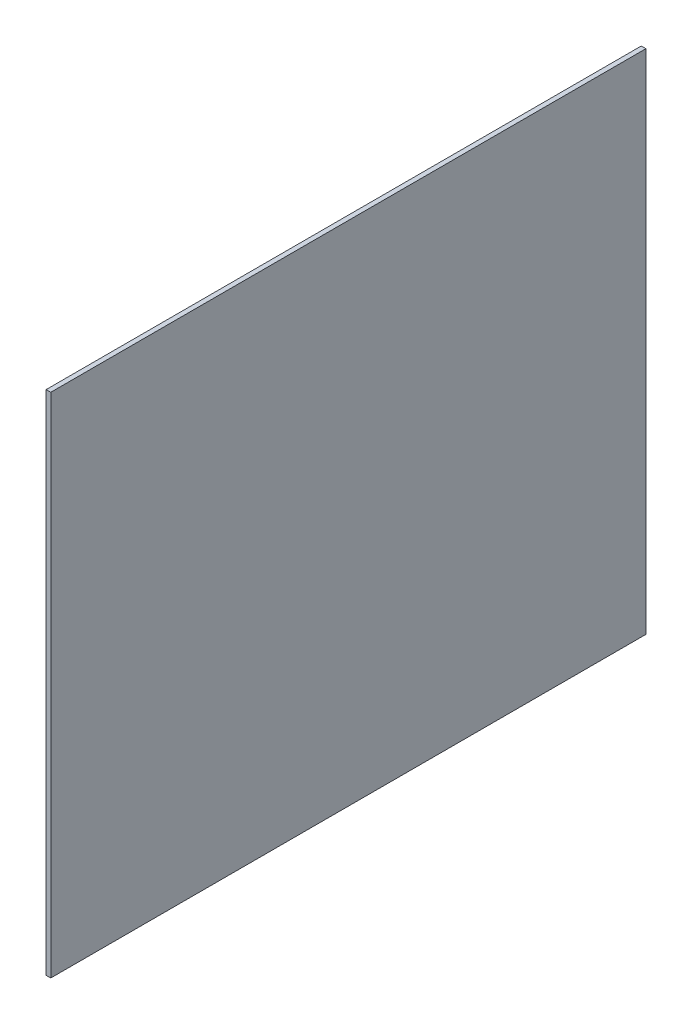
ISO-10303-21;
HEADER;
FILE_DESCRIPTION(('STEP AP214'),'2;1');
FILE_NAME('part.step','',(''),(''),'','','');
FILE_SCHEMA(('AUTOMOTIVE_DESIGN { 1 0 10303 214 1 1 1 1 }'));
ENDSEC;
DATA;
#1=APPLICATION_CONTEXT('core data for automotive mechanical design processes');
#2=APPLICATION_PROTOCOL_DEFINITION('international standard','automotive_design',2000,#1);
#3=PRODUCT_CONTEXT('',#1,'mechanical');
#4=PRODUCT('Part','Part','',(#3));
#5=PRODUCT_RELATED_PRODUCT_CATEGORY('part','',(#4));
#6=PRODUCT_DEFINITION_FORMATION('','',#4);
#7=PRODUCT_DEFINITION_CONTEXT('part definition',#1,'design');
#8=PRODUCT_DEFINITION('design','',#6,#7);
#9=PRODUCT_DEFINITION_SHAPE('','',#8);
#10=(LENGTH_UNIT() NAMED_UNIT(*) SI_UNIT(.MILLI.,.METRE.));
#11=(NAMED_UNIT(*) PLANE_ANGLE_UNIT() SI_UNIT($,.RADIAN.));
#12=(NAMED_UNIT(*) SI_UNIT($,.STERADIAN.) SOLID_ANGLE_UNIT());
#13=UNCERTAINTY_MEASURE_WITH_UNIT(LENGTH_MEASURE(1.E-05),#10,'distance_accuracy_value','');
#14=(GEOMETRIC_REPRESENTATION_CONTEXT(3) GLOBAL_UNCERTAINTY_ASSIGNED_CONTEXT((#13)) GLOBAL_UNIT_ASSIGNED_CONTEXT((#10,
#11,#12)) REPRESENTATION_CONTEXT('',''));
#15=CARTESIAN_POINT('',(0.,0.,0.));
#16=DIRECTION('',(0.,0.,1.));
#17=DIRECTION('',(1.,0.,0.));
#18=AXIS2_PLACEMENT_3D('',#15,#16,#17);
#19=CARTESIAN_POINT('',(-41.8021501378691,637.630930693683,812.00752));
#20=DIRECTION('',(1.,0.,0.));
#21=DIRECTION('',(0.,1.,0.));
#22=AXIS2_PLACEMENT_3D('',#19,#20,#21);
#23=PLANE('',#22);
#24=DIRECTION('',(0.,-1.,0.));
#25=VECTOR('',#24,1.);
#26=CARTESIAN_POINT('',(-41.8021501378691,637.630930693683,0.));
#27=LINE('',#26,#25);
#28=CARTESIAN_POINT('',(-41.8021501378691,637.630930693683,0.));
#29=VERTEX_POINT('',#28);
#30=CARTESIAN_POINT('',(-41.8021501378691,-54.5190693063172,0.));
#31=VERTEX_POINT('',#30);
#32=EDGE_CURVE('E96',#29,#31,#27,.T.);
#33=ORIENTED_EDGE('',*,*,#32,.T.);
#34=DIRECTION('',(0.,0.,-1.));
#35=VECTOR('',#34,1.);
#36=CARTESIAN_POINT('',(-41.8021501378691,-54.5190693063172,812.00752));
#37=LINE('',#36,#35);
#38=CARTESIAN_POINT('',(-41.8021501378691,-54.5190693063172,812.00752));
#39=VERTEX_POINT('',#38);
#40=EDGE_CURVE('E11',#39,#31,#37,.T.);
#41=ORIENTED_EDGE('',*,*,#40,.F.);
#42=DIRECTION('',(0.,-1.,0.));
#43=VECTOR('',#42,1.);
#44=CARTESIAN_POINT('',(-41.8021501378691,637.630930693683,812.00752));
#45=LINE('',#44,#43);
#46=CARTESIAN_POINT('',(-41.8021501378691,637.630930693683,812.00752));
#47=VERTEX_POINT('',#46);
#48=EDGE_CURVE('E84',#47,#39,#45,.T.);
#49=ORIENTED_EDGE('',*,*,#48,.F.);
#50=DIRECTION('',(0.,0.,-1.));
#51=VECTOR('',#50,1.);
#52=CARTESIAN_POINT('',(-41.8021501378691,637.630930693683,812.00752));
#53=LINE('',#52,#51);
#54=EDGE_CURVE('E92',#47,#29,#53,.T.);
#55=ORIENTED_EDGE('',*,*,#54,.T.);
#56=EDGE_LOOP('',(#33,#41,#49,#55));
#57=FACE_BOUND('',#56,.T.);
#58=ADVANCED_FACE('F33',(#57),#23,.F.);
#59=CARTESIAN_POINT('',(-41.8021501378691,-54.5190693063172,812.00752));
#60=DIRECTION('',(0.,1.,0.));
#61=DIRECTION('',(0.,0.,1.));
#62=AXIS2_PLACEMENT_3D('',#59,#60,#61);
#63=PLANE('',#62);
#64=DIRECTION('',(1.,0.,0.));
#65=VECTOR('',#64,1.);
#66=CARTESIAN_POINT('',(-41.8021501378691,-54.5190693063172,0.));
#67=LINE('',#66,#65);
#68=CARTESIAN_POINT('',(-35.4521501378691,-54.5190693063172,0.));
#69=VERTEX_POINT('',#68);
#70=EDGE_CURVE('E88',#31,#69,#67,.T.);
#71=ORIENTED_EDGE('',*,*,#70,.T.);
#72=DIRECTION('',(0.,0.,-1.));
#73=VECTOR('',#72,1.);
#74=CARTESIAN_POINT('',(-35.4521501378691,-54.5190693063172,812.00752));
#75=LINE('',#74,#73);
#76=CARTESIAN_POINT('',(-35.4521501378691,-54.5190693063172,812.00752));
#77=VERTEX_POINT('',#76);
#78=EDGE_CURVE('E41',#77,#69,#75,.T.);
#79=ORIENTED_EDGE('',*,*,#78,.F.);
#80=DIRECTION('',(1.,0.,0.));
#81=VECTOR('',#80,1.);
#82=CARTESIAN_POINT('',(-41.8021501378691,-54.5190693063172,812.00752));
#83=LINE('',#82,#81);
#84=EDGE_CURVE('E79',#39,#77,#83,.T.);
#85=ORIENTED_EDGE('',*,*,#84,.F.);
#86=ORIENTED_EDGE('',*,*,#40,.T.);
#87=EDGE_LOOP('',(#71,#79,#85,#86));
#88=FACE_BOUND('',#87,.T.);
#89=ADVANCED_FACE('F87',(#88),#63,.F.);
#90=CARTESIAN_POINT('',(-35.4521501378691,637.630930693683,812.00752));
#91=DIRECTION('',(-1.,0.,0.));
#92=DIRECTION('',(0.,-1.,0.));
#93=AXIS2_PLACEMENT_3D('',#90,#91,#92);
#94=PLANE('',#93);
#95=DIRECTION('',(0.,1.,0.));
#96=VECTOR('',#95,1.);
#97=CARTESIAN_POINT('',(-35.4521501378691,637.630930693683,0.));
#98=LINE('',#97,#96);
#99=CARTESIAN_POINT('',(-35.4521501378691,637.630930693683,0.));
#100=VERTEX_POINT('',#99);
#101=EDGE_CURVE('E66',#69,#100,#98,.T.);
#102=ORIENTED_EDGE('',*,*,#101,.T.);
#103=DIRECTION('',(0.,0.,-1.));
#104=VECTOR('',#103,1.);
#105=CARTESIAN_POINT('',(-35.4521501378691,637.630930693683,812.00752));
#106=LINE('',#105,#104);
#107=CARTESIAN_POINT('',(-35.4521501378691,637.630930693683,812.00752));
#108=VERTEX_POINT('',#107);
#109=EDGE_CURVE('E89',#108,#100,#106,.T.);
#110=ORIENTED_EDGE('',*,*,#109,.F.);
#111=DIRECTION('',(0.,1.,0.));
#112=VECTOR('',#111,1.);
#113=CARTESIAN_POINT('',(-35.4521501378691,637.630930693683,812.00752));
#114=LINE('',#113,#112);
#115=EDGE_CURVE('E82',#77,#108,#114,.T.);
#116=ORIENTED_EDGE('',*,*,#115,.F.);
#117=ORIENTED_EDGE('',*,*,#78,.T.);
#118=EDGE_LOOP('',(#102,#110,#116,#117));
#119=FACE_BOUND('',#118,.T.);
#120=ADVANCED_FACE('F90',(#119),#94,.F.);
#121=CARTESIAN_POINT('',(-41.8021501378691,637.630930693683,812.00752));
#122=DIRECTION('',(0.,-1.,0.));
#123=DIRECTION('',(0.,0.,-1.));
#124=AXIS2_PLACEMENT_3D('',#121,#122,#123);
#125=PLANE('',#124);
#126=DIRECTION('',(-1.,0.,0.));
#127=VECTOR('',#126,1.);
#128=CARTESIAN_POINT('',(-41.8021501378691,637.630930693683,0.));
#129=LINE('',#128,#127);
#130=EDGE_CURVE('E72',#100,#29,#129,.T.);
#131=ORIENTED_EDGE('',*,*,#130,.T.);
#132=ORIENTED_EDGE('',*,*,#54,.F.);
#133=DIRECTION('',(-1.,0.,0.));
#134=VECTOR('',#133,1.);
#135=CARTESIAN_POINT('',(-41.8021501378691,637.630930693683,812.00752));
#136=LINE('',#135,#134);
#137=EDGE_CURVE('E49',#108,#47,#136,.T.);
#138=ORIENTED_EDGE('',*,*,#137,.F.);
#139=ORIENTED_EDGE('',*,*,#109,.T.);
#140=EDGE_LOOP('',(#131,#132,#138,#139));
#141=FACE_BOUND('',#140,.T.);
#142=ADVANCED_FACE('F103',(#141),#125,.F.);
#143=CARTESIAN_POINT('',(0.,0.,812.00752));
#144=DIRECTION('',(0.,0.,1.));
#145=DIRECTION('',(1.,0.,0.));
#146=AXIS2_PLACEMENT_3D('',#143,#144,#145);
#147=PLANE('',#146);
#148=ORIENTED_EDGE('',*,*,#48,.T.);
#149=ORIENTED_EDGE('',*,*,#84,.T.);
#150=ORIENTED_EDGE('',*,*,#115,.T.);
#151=ORIENTED_EDGE('',*,*,#137,.T.);
#152=EDGE_LOOP('',(#148,#149,#150,#151));
#153=FACE_BOUND('',#152,.T.);
#154=ADVANCED_FACE('F80',(#153),#147,.T.);
#155=CARTESIAN_POINT('',(0.,0.,0.));
#156=DIRECTION('',(0.,0.,1.));
#157=DIRECTION('',(1.,0.,0.));
#158=AXIS2_PLACEMENT_3D('',#155,#156,#157);
#159=PLANE('',#158);
#160=ORIENTED_EDGE('',*,*,#32,.F.);
#161=ORIENTED_EDGE('',*,*,#130,.F.);
#162=ORIENTED_EDGE('',*,*,#101,.F.);
#163=ORIENTED_EDGE('',*,*,#70,.F.);
#164=EDGE_LOOP('',(#160,#161,#162,#163));
#165=FACE_BOUND('',#164,.T.);
#166=ADVANCED_FACE('F106',(#165),#159,.F.);
#167=CLOSED_SHELL('',(#58,#89,#120,#142,#154,#166));
#168=MANIFOLD_SOLID_BREP('B2',#167);
#169=ADVANCED_BREP_SHAPE_REPRESENTATION('',(#18,#168),#14);
#170=SHAPE_DEFINITION_REPRESENTATION(#9,#169);
ENDSEC;
END-ISO-10303-21;
